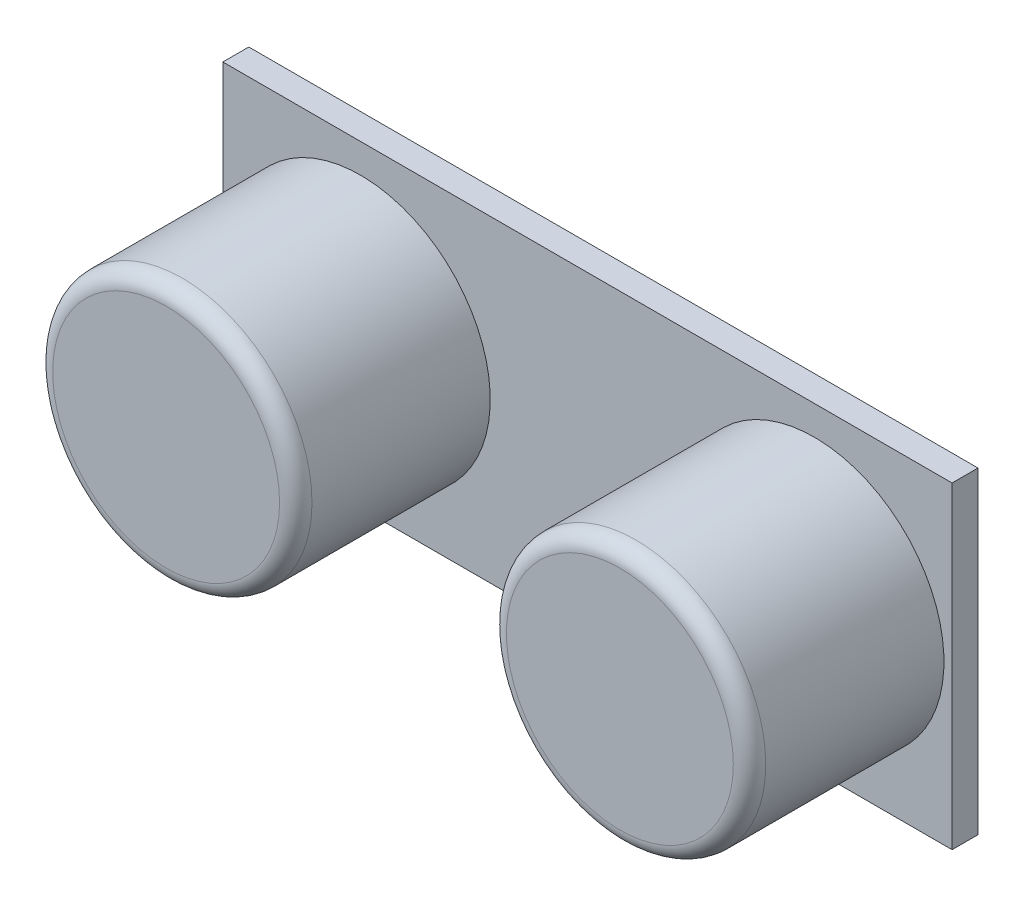
ISO-10303-21;
HEADER;
FILE_DESCRIPTION(('STEP AP214'),'2;1');
FILE_NAME('part.step','',(''),(''),'','','');
FILE_SCHEMA(('AUTOMOTIVE_DESIGN { 1 0 10303 214 1 1 1 1 }'));
ENDSEC;
DATA;
#1=APPLICATION_CONTEXT('core data for automotive mechanical design processes');
#2=APPLICATION_PROTOCOL_DEFINITION('international standard','automotive_design',2000,#1);
#3=PRODUCT_CONTEXT('',#1,'mechanical');
#4=PRODUCT('Part','Part','',(#3));
#5=PRODUCT_RELATED_PRODUCT_CATEGORY('part','',(#4));
#6=PRODUCT_DEFINITION_FORMATION('','',#4);
#7=PRODUCT_DEFINITION_CONTEXT('part definition',#1,'design');
#8=PRODUCT_DEFINITION('design','',#6,#7);
#9=PRODUCT_DEFINITION_SHAPE('','',#8);
#10=(LENGTH_UNIT() NAMED_UNIT(*) SI_UNIT(.MILLI.,.METRE.));
#11=(NAMED_UNIT(*) PLANE_ANGLE_UNIT() SI_UNIT($,.RADIAN.));
#12=(NAMED_UNIT(*) SI_UNIT($,.STERADIAN.) SOLID_ANGLE_UNIT());
#13=UNCERTAINTY_MEASURE_WITH_UNIT(LENGTH_MEASURE(1.E-05),#10,'distance_accuracy_value','');
#14=(GEOMETRIC_REPRESENTATION_CONTEXT(3) GLOBAL_UNCERTAINTY_ASSIGNED_CONTEXT((#13)) GLOBAL_UNIT_ASSIGNED_CONTEXT((#10,
#11,#12)) REPRESENTATION_CONTEXT('',''));
#15=CARTESIAN_POINT('',(0.,0.,0.));
#16=DIRECTION('',(0.,0.,1.));
#17=DIRECTION('',(1.,0.,0.));
#18=AXIS2_PLACEMENT_3D('',#15,#16,#17);
#19=CARTESIAN_POINT('',(0.,0.,1.6));
#20=DIRECTION('',(1.,0.,0.));
#21=DIRECTION('',(0.,0.,-1.));
#22=AXIS2_PLACEMENT_3D('',#19,#20,#21);
#23=PLANE('',#22);
#24=DIRECTION('',(0.,-1.,0.));
#25=VECTOR('',#24,1.);
#26=CARTESIAN_POINT('',(0.,0.,0.));
#27=LINE('',#26,#25);
#28=CARTESIAN_POINT('',(0.,19.6,0.));
#29=VERTEX_POINT('',#28);
#30=CARTESIAN_POINT('',(0.,0.,0.));
#31=VERTEX_POINT('',#30);
#32=EDGE_CURVE('E112',#29,#31,#27,.T.);
#33=ORIENTED_EDGE('',*,*,#32,.T.);
#34=DIRECTION('',(0.,0.,-1.));
#35=VECTOR('',#34,1.);
#36=CARTESIAN_POINT('',(0.,0.,1.6));
#37=LINE('',#36,#35);
#38=CARTESIAN_POINT('',(0.,0.,1.6));
#39=VERTEX_POINT('',#38);
#40=EDGE_CURVE('E101',#39,#31,#37,.T.);
#41=ORIENTED_EDGE('',*,*,#40,.F.);
#42=DIRECTION('',(0.,-1.,0.));
#43=VECTOR('',#42,1.);
#44=CARTESIAN_POINT('',(0.,0.,1.6));
#45=LINE('',#44,#43);
#46=CARTESIAN_POINT('',(0.,19.6,1.6));
#47=VERTEX_POINT('',#46);
#48=EDGE_CURVE('E93',#47,#39,#45,.T.);
#49=ORIENTED_EDGE('',*,*,#48,.F.);
#50=DIRECTION('',(0.,0.,-1.));
#51=VECTOR('',#50,1.);
#52=CARTESIAN_POINT('',(0.,19.6,1.6));
#53=LINE('',#52,#51);
#54=EDGE_CURVE('E108',#47,#29,#53,.T.);
#55=ORIENTED_EDGE('',*,*,#54,.T.);
#56=EDGE_LOOP('',(#33,#41,#49,#55));
#57=FACE_BOUND('',#56,.T.);
#58=ADVANCED_FACE('F39',(#57),#23,.F.);
#59=CARTESIAN_POINT('',(0.,0.,1.6));
#60=DIRECTION('',(0.,1.,0.));
#61=DIRECTION('',(0.,0.,1.));
#62=AXIS2_PLACEMENT_3D('',#59,#60,#61);
#63=PLANE('',#62);
#64=DIRECTION('',(1.,0.,0.));
#65=VECTOR('',#64,1.);
#66=CARTESIAN_POINT('',(0.,0.,0.));
#67=LINE('',#66,#65);
#68=CARTESIAN_POINT('',(45.,0.,0.));
#69=VERTEX_POINT('',#68);
#70=EDGE_CURVE('E99',#31,#69,#67,.T.);
#71=ORIENTED_EDGE('',*,*,#70,.T.);
#72=DIRECTION('',(0.,0.,-1.));
#73=VECTOR('',#72,1.);
#74=CARTESIAN_POINT('',(45.,0.,1.6));
#75=LINE('',#74,#73);
#76=CARTESIAN_POINT('',(45.,0.,1.6));
#77=VERTEX_POINT('',#76);
#78=EDGE_CURVE('E97',#77,#69,#75,.T.);
#79=ORIENTED_EDGE('',*,*,#78,.F.);
#80=DIRECTION('',(1.,0.,0.));
#81=VECTOR('',#80,1.);
#82=CARTESIAN_POINT('',(0.,0.,1.6));
#83=LINE('',#82,#81);
#84=EDGE_CURVE('E88',#39,#77,#83,.T.);
#85=ORIENTED_EDGE('',*,*,#84,.F.);
#86=ORIENTED_EDGE('',*,*,#40,.T.);
#87=EDGE_LOOP('',(#71,#79,#85,#86));
#88=FACE_BOUND('',#87,.T.);
#89=ADVANCED_FACE('F98',(#88),#63,.F.);
#90=CARTESIAN_POINT('',(45.,0.,1.6));
#91=DIRECTION('',(-1.,0.,0.));
#92=DIRECTION('',(0.,0.,1.));
#93=AXIS2_PLACEMENT_3D('',#90,#91,#92);
#94=PLANE('',#93);
#95=DIRECTION('',(0.,1.,0.));
#96=VECTOR('',#95,1.);
#97=CARTESIAN_POINT('',(45.,0.,0.));
#98=LINE('',#97,#96);
#99=CARTESIAN_POINT('',(45.,19.6,0.));
#100=VERTEX_POINT('',#99);
#101=EDGE_CURVE('E74',#69,#100,#98,.T.);
#102=ORIENTED_EDGE('',*,*,#101,.T.);
#103=DIRECTION('',(0.,0.,-1.));
#104=VECTOR('',#103,1.);
#105=CARTESIAN_POINT('',(45.,19.6,1.6));
#106=LINE('',#105,#104);
#107=CARTESIAN_POINT('',(45.,19.6,1.6));
#108=VERTEX_POINT('',#107);
#109=EDGE_CURVE('E102',#108,#100,#106,.T.);
#110=ORIENTED_EDGE('',*,*,#109,.F.);
#111=DIRECTION('',(0.,1.,0.));
#112=VECTOR('',#111,1.);
#113=CARTESIAN_POINT('',(45.,0.,1.6));
#114=LINE('',#113,#112);
#115=EDGE_CURVE('E91',#77,#108,#114,.T.);
#116=ORIENTED_EDGE('',*,*,#115,.F.);
#117=ORIENTED_EDGE('',*,*,#78,.T.);
#118=EDGE_LOOP('',(#102,#110,#116,#117));
#119=FACE_BOUND('',#118,.T.);
#120=ADVANCED_FACE('F104',(#119),#94,.F.);
#121=CARTESIAN_POINT('',(0.,19.6,1.6));
#122=DIRECTION('',(0.,-1.,0.));
#123=DIRECTION('',(0.,0.,-1.));
#124=AXIS2_PLACEMENT_3D('',#121,#122,#123);
#125=PLANE('',#124);
#126=DIRECTION('',(-1.,0.,0.));
#127=VECTOR('',#126,1.);
#128=CARTESIAN_POINT('',(0.,19.6,0.));
#129=LINE('',#128,#127);
#130=EDGE_CURVE('E80',#100,#29,#129,.T.);
#131=ORIENTED_EDGE('',*,*,#130,.T.);
#132=ORIENTED_EDGE('',*,*,#54,.F.);
#133=DIRECTION('',(-1.,0.,0.));
#134=VECTOR('',#133,1.);
#135=CARTESIAN_POINT('',(0.,19.6,1.6));
#136=LINE('',#135,#134);
#137=EDGE_CURVE('E57',#108,#47,#136,.T.);
#138=ORIENTED_EDGE('',*,*,#137,.F.);
#139=ORIENTED_EDGE('',*,*,#109,.T.);
#140=EDGE_LOOP('',(#131,#132,#138,#139));
#141=FACE_BOUND('',#140,.T.);
#142=ADVANCED_FACE('F168',(#141),#125,.F.);
#143=CARTESIAN_POINT('',(0.,0.,1.6));
#144=DIRECTION('',(0.,0.,-1.));
#145=DIRECTION('',(-1.,0.,0.));
#146=AXIS2_PLACEMENT_3D('',#143,#144,#145);
#147=PLANE('',#146);
#148=CARTESIAN_POINT('',(36.5,9.8,1.6));
#149=DIRECTION('',(0.,0.,-1.));
#150=DIRECTION('',(-1.,0.,0.));
#151=AXIS2_PLACEMENT_3D('',#148,#149,#150);
#152=CIRCLE('',#151,8.);
#153=CARTESIAN_POINT('',(28.5,9.8,1.6));
#154=VERTEX_POINT('',#153);
#155=EDGE_CURVE('E132',#154,#154,#152,.F.);
#156=ORIENTED_EDGE('',*,*,#155,.F.);
#157=EDGE_LOOP('',(#156));
#158=FACE_BOUND('',#157,.T.);
#159=CARTESIAN_POINT('',(8.5,9.8,1.6));
#160=DIRECTION('',(0.,0.,-1.));
#161=DIRECTION('',(-1.,0.,0.));
#162=AXIS2_PLACEMENT_3D('',#159,#160,#161);
#163=CIRCLE('',#162,8.);
#164=CARTESIAN_POINT('',(0.499999999999999,9.8,1.6));
#165=VERTEX_POINT('',#164);
#166=EDGE_CURVE('E128',#165,#165,#163,.F.);
#167=ORIENTED_EDGE('',*,*,#166,.F.);
#168=EDGE_LOOP('',(#167));
#169=FACE_BOUND('',#168,.T.);
#170=ORIENTED_EDGE('',*,*,#48,.T.);
#171=ORIENTED_EDGE('',*,*,#84,.T.);
#172=ORIENTED_EDGE('',*,*,#115,.T.);
#173=ORIENTED_EDGE('',*,*,#137,.T.);
#174=EDGE_LOOP('',(#170,#171,#172,#173));
#175=FACE_BOUND('',#174,.T.);
#176=ADVANCED_FACE('F89',(#158,#169,#175),#147,.F.);
#177=CARTESIAN_POINT('',(0.,0.,0.));
#178=DIRECTION('',(0.,0.,-1.));
#179=DIRECTION('',(-1.,0.,0.));
#180=AXIS2_PLACEMENT_3D('',#177,#178,#179);
#181=PLANE('',#180);
#182=ORIENTED_EDGE('',*,*,#32,.F.);
#183=ORIENTED_EDGE('',*,*,#130,.F.);
#184=ORIENTED_EDGE('',*,*,#101,.F.);
#185=ORIENTED_EDGE('',*,*,#70,.F.);
#186=EDGE_LOOP('',(#182,#183,#184,#185));
#187=FACE_BOUND('',#186,.T.);
#188=ADVANCED_FACE('F171',(#187),#181,.T.);
#189=CARTESIAN_POINT('',(8.5,9.8,13.6));
#190=DIRECTION('',(0.,0.,-1.));
#191=DIRECTION('',(-1.,0.,0.));
#192=AXIS2_PLACEMENT_3D('',#189,#190,#191);
#193=CYLINDRICAL_SURFACE('',#192,8.);
#194=CARTESIAN_POINT('',(8.5,9.8,12.6));
#195=DIRECTION('',(0.,0.,1.));
#196=DIRECTION('',(1.,0.,0.));
#197=AXIS2_PLACEMENT_3D('',#194,#195,#196);
#198=CIRCLE('',#197,8.);
#199=CARTESIAN_POINT('',(16.5,9.8,12.6));
#200=VERTEX_POINT('',#199);
#201=EDGE_CURVE('E11',#200,#200,#198,.F.);
#202=ORIENTED_EDGE('',*,*,#201,.T.);
#203=EDGE_LOOP('',(#202));
#204=FACE_BOUND('',#203,.T.);
#205=ORIENTED_EDGE('',*,*,#166,.T.);
#206=EDGE_LOOP('',(#205));
#207=FACE_BOUND('',#206,.T.);
#208=ADVANCED_FACE('F174',(#204,#207),#193,.T.);
#209=CARTESIAN_POINT('',(8.5,9.8,13.6));
#210=DIRECTION('',(0.,0.,1.));
#211=DIRECTION('',(1.,0.,0.));
#212=AXIS2_PLACEMENT_3D('',#209,#210,#211);
#213=PLANE('',#212);
#214=CARTESIAN_POINT('',(8.5,9.8,13.6));
#215=DIRECTION('',(0.,0.,1.));
#216=DIRECTION('',(1.,0.,0.));
#217=AXIS2_PLACEMENT_3D('',#214,#215,#216);
#218=CIRCLE('',#217,7.);
#219=CARTESIAN_POINT('',(15.5,9.8,13.6));
#220=VERTEX_POINT('',#219);
#221=EDGE_CURVE('E49',#220,#220,#218,.T.);
#222=ORIENTED_EDGE('',*,*,#221,.T.);
#223=EDGE_LOOP('',(#222));
#224=FACE_BOUND('',#223,.T.);
#225=ADVANCED_FACE('F147',(#224),#213,.T.);
#226=CARTESIAN_POINT('',(36.5,9.8,13.6));
#227=DIRECTION('',(0.,0.,-1.));
#228=DIRECTION('',(-1.,0.,0.));
#229=AXIS2_PLACEMENT_3D('',#226,#227,#228);
#230=CYLINDRICAL_SURFACE('',#229,8.);
#231=CARTESIAN_POINT('',(36.5,9.8,12.6));
#232=DIRECTION('',(0.,0.,1.));
#233=DIRECTION('',(1.,0.,0.));
#234=AXIS2_PLACEMENT_3D('',#231,#232,#233);
#235=CIRCLE('',#234,8.);
#236=CARTESIAN_POINT('',(44.5,9.8,12.6));
#237=VERTEX_POINT('',#236);
#238=EDGE_CURVE('E140',#237,#237,#235,.F.);
#239=ORIENTED_EDGE('',*,*,#238,.T.);
#240=EDGE_LOOP('',(#239));
#241=FACE_BOUND('',#240,.T.);
#242=ORIENTED_EDGE('',*,*,#155,.T.);
#243=EDGE_LOOP('',(#242));
#244=FACE_BOUND('',#243,.T.);
#245=ADVANCED_FACE('F184',(#241,#244),#230,.T.);
#246=CARTESIAN_POINT('',(36.5,9.8,13.6));
#247=DIRECTION('',(0.,0.,1.));
#248=DIRECTION('',(1.,0.,0.));
#249=AXIS2_PLACEMENT_3D('',#246,#247,#248);
#250=PLANE('',#249);
#251=CARTESIAN_POINT('',(36.5,9.8,13.6));
#252=DIRECTION('',(0.,0.,1.));
#253=DIRECTION('',(1.,0.,0.));
#254=AXIS2_PLACEMENT_3D('',#251,#252,#253);
#255=CIRCLE('',#254,7.);
#256=CARTESIAN_POINT('',(43.5,9.8,13.6));
#257=VERTEX_POINT('',#256);
#258=EDGE_CURVE('E136',#257,#257,#255,.T.);
#259=ORIENTED_EDGE('',*,*,#258,.T.);
#260=EDGE_LOOP('',(#259));
#261=FACE_BOUND('',#260,.T.);
#262=ADVANCED_FACE('F155',(#261),#250,.T.);
#263=CARTESIAN_POINT('',(36.5,9.8,12.6));
#264=DIRECTION('',(0.,0.,1.));
#265=DIRECTION('',(1.,0.,0.));
#266=AXIS2_PLACEMENT_3D('',#263,#264,#265);
#267=TOROIDAL_SURFACE('',#266,7.,1.);
#268=ORIENTED_EDGE('',*,*,#238,.F.);
#269=EDGE_LOOP('',(#268));
#270=FACE_BOUND('',#269,.T.);
#271=ORIENTED_EDGE('',*,*,#258,.F.);
#272=EDGE_LOOP('',(#271));
#273=FACE_BOUND('',#272,.T.);
#274=ADVANCED_FACE('F150',(#270,#273),#267,.T.);
#275=CARTESIAN_POINT('',(8.5,9.8,12.6));
#276=DIRECTION('',(0.,0.,1.));
#277=DIRECTION('',(1.,0.,0.));
#278=AXIS2_PLACEMENT_3D('',#275,#276,#277);
#279=TOROIDAL_SURFACE('',#278,7.,1.);
#280=ORIENTED_EDGE('',*,*,#201,.F.);
#281=EDGE_LOOP('',(#280));
#282=FACE_BOUND('',#281,.T.);
#283=ORIENTED_EDGE('',*,*,#221,.F.);
#284=EDGE_LOOP('',(#283));
#285=FACE_BOUND('',#284,.T.);
#286=ADVANCED_FACE('F41',(#282,#285),#279,.T.);
#287=CLOSED_SHELL('',(#58,#89,#120,#142,#176,#188,#208,#225,#245,#262,#274,#286));
#288=MANIFOLD_SOLID_BREP('B2',#287);
#289=ADVANCED_BREP_SHAPE_REPRESENTATION('',(#18,#288),#14);
#290=SHAPE_DEFINITION_REPRESENTATION(#9,#289);
ENDSEC;
END-ISO-10303-21;
